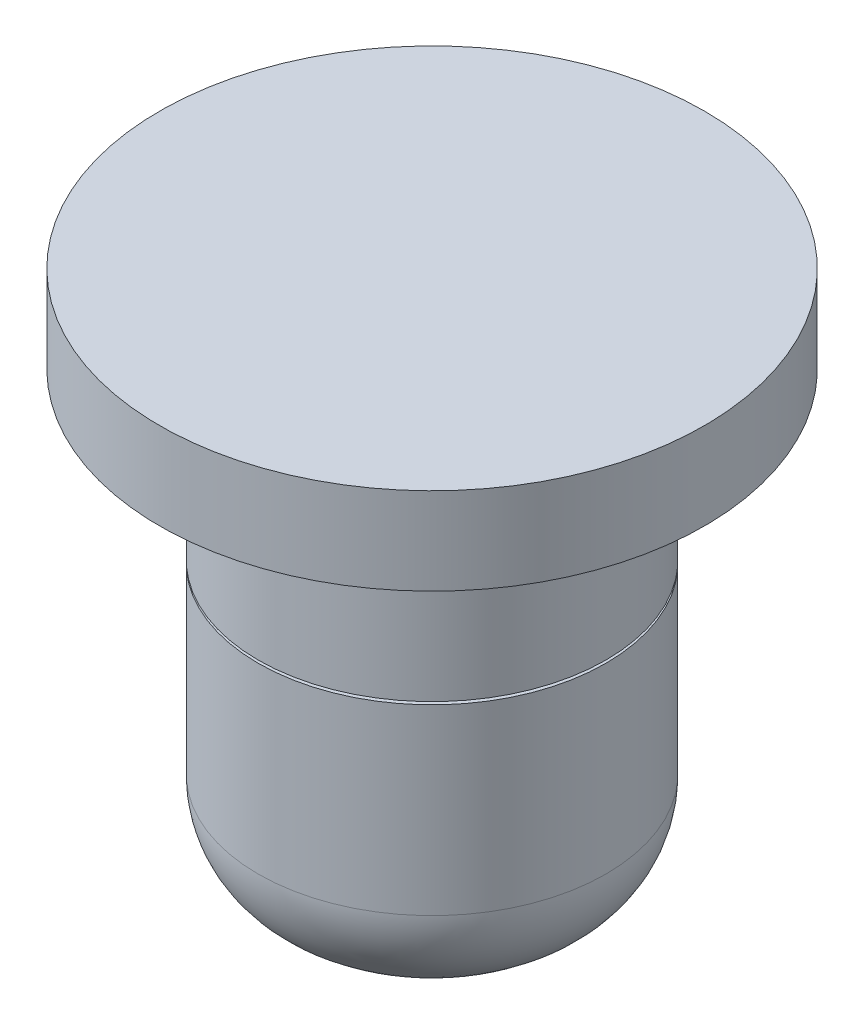
ISO-10303-21;
HEADER;
FILE_DESCRIPTION(('STEP AP214'),'2;1');
FILE_NAME('part.step','',(''),(''),'','','');
FILE_SCHEMA(('AUTOMOTIVE_DESIGN { 1 0 10303 214 1 1 1 1 }'));
ENDSEC;
DATA;
#1=APPLICATION_CONTEXT('core data for automotive mechanical design processes');
#2=APPLICATION_PROTOCOL_DEFINITION('international standard','automotive_design',2000,#1);
#3=PRODUCT_CONTEXT('',#1,'mechanical');
#4=PRODUCT('Part','Part','',(#3));
#5=PRODUCT_RELATED_PRODUCT_CATEGORY('part','',(#4));
#6=PRODUCT_DEFINITION_FORMATION('','',#4);
#7=PRODUCT_DEFINITION_CONTEXT('part definition',#1,'design');
#8=PRODUCT_DEFINITION('design','',#6,#7);
#9=PRODUCT_DEFINITION_SHAPE('','',#8);
#10=(LENGTH_UNIT() NAMED_UNIT(*) SI_UNIT(.MILLI.,.METRE.));
#11=(NAMED_UNIT(*) PLANE_ANGLE_UNIT() SI_UNIT($,.RADIAN.));
#12=(NAMED_UNIT(*) SI_UNIT($,.STERADIAN.) SOLID_ANGLE_UNIT());
#13=UNCERTAINTY_MEASURE_WITH_UNIT(LENGTH_MEASURE(1.E-05),#10,'distance_accuracy_value','');
#14=(GEOMETRIC_REPRESENTATION_CONTEXT(3) GLOBAL_UNCERTAINTY_ASSIGNED_CONTEXT((#13)) GLOBAL_UNIT_ASSIGNED_CONTEXT((#10,
#11,#12)) REPRESENTATION_CONTEXT('',''));
#15=CARTESIAN_POINT('',(0.,0.,0.));
#16=DIRECTION('',(0.,0.,1.));
#17=DIRECTION('',(1.,0.,0.));
#18=AXIS2_PLACEMENT_3D('',#15,#16,#17);
#19=CARTESIAN_POINT('',(0.,-20.955,0.));
#20=DIRECTION('',(0.,-1.,0.));
#21=DIRECTION('',(0.,0.,-1.));
#22=AXIS2_PLACEMENT_3D('',#19,#20,#21);
#23=CYLINDRICAL_SURFACE('',#22,12.7);
#24=CARTESIAN_POINT('',(0.,0.199999999999999,0.));
#25=DIRECTION('',(0.,1.,0.));
#26=DIRECTION('',(0.,0.,1.));
#27=AXIS2_PLACEMENT_3D('',#24,#25,#26);
#28=CIRCLE('',#27,12.7);
#29=CARTESIAN_POINT('',(0.,0.199999999999999,12.7));
#30=VERTEX_POINT('',#29);
#31=EDGE_CURVE('E11',#30,#30,#28,.F.);
#32=ORIENTED_EDGE('',*,*,#31,.F.);
#33=EDGE_LOOP('',(#32));
#34=FACE_BOUND('',#33,.T.);
#35=CARTESIAN_POINT('',(0.,12.2766666666667,0.));
#36=DIRECTION('',(0.,-1.,0.));
#37=DIRECTION('',(0.,0.,-1.));
#38=AXIS2_PLACEMENT_3D('',#35,#36,#37);
#39=CIRCLE('',#38,12.7);
#40=CARTESIAN_POINT('',(0.,12.2766666666667,-12.7));
#41=VERTEX_POINT('',#40);
#42=EDGE_CURVE('E43',#41,#41,#39,.T.);
#43=ORIENTED_EDGE('',*,*,#42,.T.);
#44=EDGE_LOOP('',(#43));
#45=FACE_BOUND('',#44,.T.);
#46=ADVANCED_FACE('F40',(#34,#45),#23,.T.);
#47=CARTESIAN_POINT('',(0.,18.6266666666667,0.));
#48=DIRECTION('',(0.,1.,0.));
#49=DIRECTION('',(0.,0.,1.));
#50=AXIS2_PLACEMENT_3D('',#47,#48,#49);
#51=PLANE('',#50);
#52=CARTESIAN_POINT('',(0.,18.6266666666667,0.));
#53=DIRECTION('',(0.,-1.,0.));
#54=DIRECTION('',(0.,0.,-1.));
#55=AXIS2_PLACEMENT_3D('',#52,#53,#54);
#56=CIRCLE('',#55,19.8966666666667);
#57=CARTESIAN_POINT('',(0.,18.6266666666667,-19.8966666666667));
#58=VERTEX_POINT('',#57);
#59=EDGE_CURVE('E52',#58,#58,#56,.T.);
#60=ORIENTED_EDGE('',*,*,#59,.F.);
#61=EDGE_LOOP('',(#60));
#62=FACE_BOUND('',#61,.T.);
#63=ADVANCED_FACE('F72',(#62),#51,.T.);
#64=CARTESIAN_POINT('',(0.,-20.955,0.));
#65=DIRECTION('',(0.,-1.,0.));
#66=DIRECTION('',(0.,0.,-1.));
#67=AXIS2_PLACEMENT_3D('',#64,#65,#66);
#68=CYLINDRICAL_SURFACE('',#67,19.8966666666667);
#69=ORIENTED_EDGE('',*,*,#59,.T.);
#70=EDGE_LOOP('',(#69));
#71=FACE_BOUND('',#70,.T.);
#72=CARTESIAN_POINT('',(0.,12.2766666666667,0.));
#73=DIRECTION('',(0.,-1.,0.));
#74=DIRECTION('',(0.,0.,-1.));
#75=AXIS2_PLACEMENT_3D('',#72,#73,#74);
#76=CIRCLE('',#75,19.8966666666667);
#77=CARTESIAN_POINT('',(0.,12.2766666666667,-19.8966666666667));
#78=VERTEX_POINT('',#77);
#79=EDGE_CURVE('E47',#78,#78,#76,.T.);
#80=ORIENTED_EDGE('',*,*,#79,.F.);
#81=EDGE_LOOP('',(#80));
#82=FACE_BOUND('',#81,.T.);
#83=ADVANCED_FACE('F64',(#71,#82),#68,.T.);
#84=CARTESIAN_POINT('',(19.8966666666667,12.2766666666667,0.));
#85=DIRECTION('',(0.,-1.,0.));
#86=DIRECTION('',(0.,0.,-1.));
#87=AXIS2_PLACEMENT_3D('',#84,#85,#86);
#88=PLANE('',#87);
#89=ORIENTED_EDGE('',*,*,#79,.T.);
#90=EDGE_LOOP('',(#89));
#91=FACE_BOUND('',#90,.T.);
#92=ORIENTED_EDGE('',*,*,#42,.F.);
#93=EDGE_LOOP('',(#92));
#94=FACE_BOUND('',#93,.T.);
#95=ADVANCED_FACE('F61',(#91,#94),#88,.T.);
#96=CARTESIAN_POINT('',(-36.4156280190855,0.2,-19.8966666666667));
#97=DIRECTION('',(0.,1.,0.));
#98=DIRECTION('',(0.,0.,1.));
#99=AXIS2_PLACEMENT_3D('',#96,#97,#98);
#100=PLANE('',#99);
#101=ORIENTED_EDGE('',*,*,#31,.T.);
#102=EDGE_LOOP('',(#101));
#103=FACE_BOUND('',#102,.T.);
#104=ADVANCED_FACE('F63',(#103),#100,.F.);
#105=CLOSED_SHELL('',(#46,#63,#83,#95,#104));
#106=MANIFOLD_SOLID_BREP('B2',#105);
#107=CARTESIAN_POINT('',(5.07999999999995,-20.955,0.));
#108=DIRECTION('',(0.,-1.,0.));
#109=DIRECTION('',(0.,0.,-1.));
#110=AXIS2_PLACEMENT_3D('',#107,#108,#109);
#111=PLANE('',#110);
#112=CARTESIAN_POINT('',(0.,-20.955,0.));
#113=DIRECTION('',(0.,-1.,0.));
#114=DIRECTION('',(0.,0.,-1.));
#115=AXIS2_PLACEMENT_3D('',#112,#113,#114);
#116=CIRCLE('',#115,5.07999999999995);
#117=CARTESIAN_POINT('',(0.,-20.955,-5.07999999999995));
#118=VERTEX_POINT('',#117);
#119=EDGE_CURVE('E118',#118,#118,#116,.T.);
#120=ORIENTED_EDGE('',*,*,#119,.T.);
#121=EDGE_LOOP('',(#120));
#122=FACE_BOUND('',#121,.T.);
#123=ADVANCED_FACE('F110',(#122),#111,.T.);
#124=CARTESIAN_POINT('',(0.,-13.335,0.));
#125=DIRECTION('',(0.,-1.,0.));
#126=DIRECTION('',(0.,0.,-1.));
#127=AXIS2_PLACEMENT_3D('',#124,#125,#126);
#128=DEGENERATE_TOROIDAL_SURFACE('',#127,5.08,7.62,.T.);
#129=CARTESIAN_POINT('',(0.,-13.3349999999999,0.));
#130=DIRECTION('',(0.,-1.,0.));
#131=DIRECTION('',(0.,0.,-1.));
#132=AXIS2_PLACEMENT_3D('',#129,#130,#131);
#133=CIRCLE('',#132,12.7);
#134=CARTESIAN_POINT('',(0.,-13.3349999999999,-12.7));
#135=VERTEX_POINT('',#134);
#136=EDGE_CURVE('E39',#135,#135,#133,.T.);
#137=ORIENTED_EDGE('',*,*,#136,.T.);
#138=EDGE_LOOP('',(#137));
#139=FACE_BOUND('',#138,.T.);
#140=ORIENTED_EDGE('',*,*,#119,.F.);
#141=EDGE_LOOP('',(#140));
#142=FACE_BOUND('',#141,.T.);
#143=ADVANCED_FACE('F132',(#139,#142),#128,.T.);
#144=CARTESIAN_POINT('',(0.,-20.955,0.));
#145=DIRECTION('',(0.,-1.,0.));
#146=DIRECTION('',(0.,0.,-1.));
#147=AXIS2_PLACEMENT_3D('',#144,#145,#146);
#148=CYLINDRICAL_SURFACE('',#147,12.7);
#149=CARTESIAN_POINT('',(0.,0.,0.));
#150=DIRECTION('',(0.,-1.,0.));
#151=DIRECTION('',(0.,0.,-1.));
#152=AXIS2_PLACEMENT_3D('',#149,#150,#151);
#153=CIRCLE('',#152,12.7);
#154=CARTESIAN_POINT('',(0.,0.,-12.7));
#155=VERTEX_POINT('',#154);
#156=EDGE_CURVE('E114',#155,#155,#153,.F.);
#157=ORIENTED_EDGE('',*,*,#156,.F.);
#158=EDGE_LOOP('',(#157));
#159=FACE_BOUND('',#158,.T.);
#160=ORIENTED_EDGE('',*,*,#136,.F.);
#161=EDGE_LOOP('',(#160));
#162=FACE_BOUND('',#161,.T.);
#163=ADVANCED_FACE('F112',(#159,#162),#148,.T.);
#164=CARTESIAN_POINT('',(-36.4156280190855,0.,-19.8966666666667));
#165=DIRECTION('',(0.,-1.,0.));
#166=DIRECTION('',(0.,0.,-1.));
#167=AXIS2_PLACEMENT_3D('',#164,#165,#166);
#168=PLANE('',#167);
#169=ORIENTED_EDGE('',*,*,#156,.T.);
#170=EDGE_LOOP('',(#169));
#171=FACE_BOUND('',#170,.T.);
#172=ADVANCED_FACE('F128',(#171),#168,.F.);
#173=CLOSED_SHELL('',(#123,#143,#163,#172));
#174=MANIFOLD_SOLID_BREP('B6',#173);
#175=ADVANCED_BREP_SHAPE_REPRESENTATION('',(#18,#106,#174),#14);
#176=SHAPE_DEFINITION_REPRESENTATION(#9,#175);
ENDSEC;
END-ISO-10303-21;
